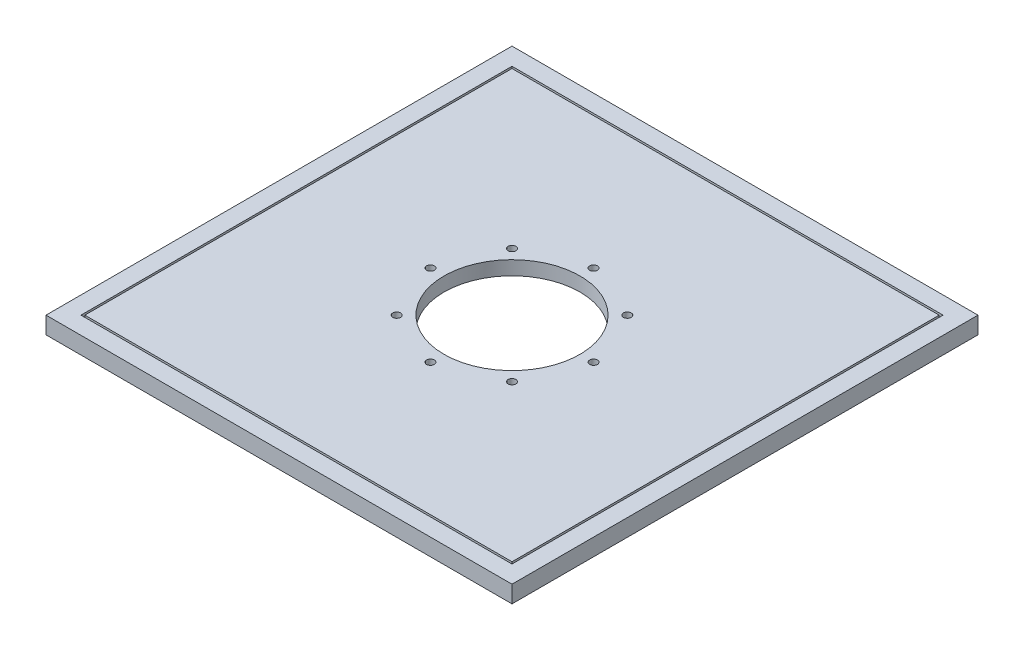
ISO-10303-21;
HEADER;
FILE_DESCRIPTION(('STEP AP214'),'2;1');
FILE_NAME('part.step','',(''),(''),'','','');
FILE_SCHEMA(('AUTOMOTIVE_DESIGN { 1 0 10303 214 1 1 1 1 }'));
ENDSEC;
DATA;
#1=APPLICATION_CONTEXT('core data for automotive mechanical design processes');
#2=APPLICATION_PROTOCOL_DEFINITION('international standard','automotive_design',2000,#1);
#3=PRODUCT_CONTEXT('',#1,'mechanical');
#4=PRODUCT('Part','Part','',(#3));
#5=PRODUCT_RELATED_PRODUCT_CATEGORY('part','',(#4));
#6=PRODUCT_DEFINITION_FORMATION('','',#4);
#7=PRODUCT_DEFINITION_CONTEXT('part definition',#1,'design');
#8=PRODUCT_DEFINITION('design','',#6,#7);
#9=PRODUCT_DEFINITION_SHAPE('','',#8);
#10=(LENGTH_UNIT() NAMED_UNIT(*) SI_UNIT(.MILLI.,.METRE.));
#11=(NAMED_UNIT(*) PLANE_ANGLE_UNIT() SI_UNIT($,.RADIAN.));
#12=(NAMED_UNIT(*) SI_UNIT($,.STERADIAN.) SOLID_ANGLE_UNIT());
#13=UNCERTAINTY_MEASURE_WITH_UNIT(LENGTH_MEASURE(1.E-05),#10,'distance_accuracy_value','');
#14=(GEOMETRIC_REPRESENTATION_CONTEXT(3) GLOBAL_UNCERTAINTY_ASSIGNED_CONTEXT((#13)) GLOBAL_UNIT_ASSIGNED_CONTEXT((#10,
#11,#12)) REPRESENTATION_CONTEXT('',''));
#15=CARTESIAN_POINT('',(0.,0.,0.));
#16=DIRECTION('',(0.,0.,1.));
#17=DIRECTION('',(1.,0.,0.));
#18=AXIS2_PLACEMENT_3D('',#15,#16,#17);
#19=CARTESIAN_POINT('',(0.,0.,0.));
#20=DIRECTION('',(0.,1.,0.));
#21=DIRECTION('',(0.,0.,1.));
#22=AXIS2_PLACEMENT_3D('',#19,#20,#21);
#23=CYLINDRICAL_SURFACE('',#22,87.5);
#24=CARTESIAN_POINT('',(0.,22.,0.));
#25=DIRECTION('',(0.,1.,0.));
#26=DIRECTION('',(0.,0.,1.));
#27=AXIS2_PLACEMENT_3D('',#24,#25,#26);
#28=CIRCLE('',#27,87.5);
#29=CARTESIAN_POINT('',(0.,22.,87.5));
#30=VERTEX_POINT('',#29);
#31=EDGE_CURVE('E202',#30,#30,#28,.T.);
#32=ORIENTED_EDGE('',*,*,#31,.T.);
#33=EDGE_LOOP('',(#32));
#34=FACE_BOUND('',#33,.T.);
#35=CARTESIAN_POINT('',(0.,4.,0.));
#36=DIRECTION('',(0.,-1.,0.));
#37=DIRECTION('',(0.,0.,-1.));
#38=AXIS2_PLACEMENT_3D('',#35,#36,#37);
#39=CIRCLE('',#38,87.5);
#40=CARTESIAN_POINT('',(0.,4.,-87.5));
#41=VERTEX_POINT('',#40);
#42=EDGE_CURVE('E47',#41,#41,#39,.F.);
#43=ORIENTED_EDGE('',*,*,#42,.F.);
#44=EDGE_LOOP('',(#43));
#45=FACE_BOUND('',#44,.T.);
#46=ADVANCED_FACE('F43',(#34,#45),#23,.F.);
#47=CARTESIAN_POINT('',(0.,22.,0.));
#48=DIRECTION('',(0.,1.,0.));
#49=DIRECTION('',(0.,0.,1.));
#50=AXIS2_PLACEMENT_3D('',#47,#48,#49);
#51=PLANE('',#50);
#52=CARTESIAN_POINT('',(0.,22.,105.));
#53=DIRECTION('',(0.,-1.,0.));
#54=DIRECTION('',(0.,0.,-1.));
#55=AXIS2_PLACEMENT_3D('',#52,#53,#54);
#56=CIRCLE('',#55,5.);
#57=CARTESIAN_POINT('',(0.,22.,100.));
#58=VERTEX_POINT('',#57);
#59=EDGE_CURVE('E474',#58,#58,#56,.T.);
#60=ORIENTED_EDGE('',*,*,#59,.T.);
#61=EDGE_LOOP('',(#60));
#62=FACE_BOUND('',#61,.T.);
#63=CARTESIAN_POINT('',(74.2462120245876,22.,74.2462120245874));
#64=DIRECTION('',(0.,-1.,0.));
#65=DIRECTION('',(0.,0.,-1.));
#66=AXIS2_PLACEMENT_3D('',#63,#64,#65);
#67=CIRCLE('',#66,5.00000000000001);
#68=CARTESIAN_POINT('',(74.2462120245876,22.,69.2462120245874));
#69=VERTEX_POINT('',#68);
#70=EDGE_CURVE('E482',#69,#69,#67,.T.);
#71=ORIENTED_EDGE('',*,*,#70,.T.);
#72=EDGE_LOOP('',(#71));
#73=FACE_BOUND('',#72,.T.);
#74=CARTESIAN_POINT('',(105.,22.,-3.66605540578529E-13));
#75=DIRECTION('',(0.,-1.,0.));
#76=DIRECTION('',(0.,0.,-1.));
#77=AXIS2_PLACEMENT_3D('',#74,#75,#76);
#78=CIRCLE('',#77,5.);
#79=CARTESIAN_POINT('',(105.,22.,-5.00000000000037));
#80=VERTEX_POINT('',#79);
#81=EDGE_CURVE('E490',#80,#80,#78,.T.);
#82=ORIENTED_EDGE('',*,*,#81,.T.);
#83=EDGE_LOOP('',(#82));
#84=FACE_BOUND('',#83,.T.);
#85=CARTESIAN_POINT('',(74.2462120245871,22.,-74.2462120245879));
#86=DIRECTION('',(0.,-1.,0.));
#87=DIRECTION('',(0.,0.,-1.));
#88=AXIS2_PLACEMENT_3D('',#85,#86,#87);
#89=CIRCLE('',#88,5.00000000000001);
#90=CARTESIAN_POINT('',(74.2462120245871,22.,-79.2462120245879));
#91=VERTEX_POINT('',#90);
#92=EDGE_CURVE('E496',#91,#91,#89,.T.);
#93=ORIENTED_EDGE('',*,*,#92,.T.);
#94=EDGE_LOOP('',(#93));
#95=FACE_BOUND('',#94,.T.);
#96=CARTESIAN_POINT('',(-7.33211081157058E-13,22.,-105.));
#97=DIRECTION('',(0.,-1.,0.));
#98=DIRECTION('',(0.,0.,-1.));
#99=AXIS2_PLACEMENT_3D('',#96,#97,#98);
#100=CIRCLE('',#99,5.);
#101=CARTESIAN_POINT('',(-7.33211081157058E-13,22.,-110.));
#102=VERTEX_POINT('',#101);
#103=EDGE_CURVE('E502',#102,#102,#100,.T.);
#104=ORIENTED_EDGE('',*,*,#103,.T.);
#105=EDGE_LOOP('',(#104));
#106=FACE_BOUND('',#105,.T.);
#107=CARTESIAN_POINT('',(-74.2462120245881,22.,-74.2462120245868));
#108=DIRECTION('',(0.,-1.,0.));
#109=DIRECTION('',(0.,0.,-1.));
#110=AXIS2_PLACEMENT_3D('',#107,#108,#109);
#111=CIRCLE('',#110,5.00000000000001);
#112=CARTESIAN_POINT('',(-74.2462120245881,22.,-79.2462120245868));
#113=VERTEX_POINT('',#112);
#114=EDGE_CURVE('E508',#113,#113,#111,.T.);
#115=ORIENTED_EDGE('',*,*,#114,.T.);
#116=EDGE_LOOP('',(#115));
#117=FACE_BOUND('',#116,.T.);
#118=CARTESIAN_POINT('',(-105.,22.,1.09981662173559E-12));
#119=DIRECTION('',(0.,-1.,0.));
#120=DIRECTION('',(0.,0.,-1.));
#121=AXIS2_PLACEMENT_3D('',#118,#119,#120);
#122=CIRCLE('',#121,5.);
#123=CARTESIAN_POINT('',(-105.,22.,-4.9999999999989));
#124=VERTEX_POINT('',#123);
#125=EDGE_CURVE('E514',#124,#124,#122,.T.);
#126=ORIENTED_EDGE('',*,*,#125,.T.);
#127=EDGE_LOOP('',(#126));
#128=FACE_BOUND('',#127,.T.);
#129=CARTESIAN_POINT('',(-74.2462120245866,22.,74.2462120245884));
#130=DIRECTION('',(0.,-1.,0.));
#131=DIRECTION('',(0.,0.,-1.));
#132=AXIS2_PLACEMENT_3D('',#129,#130,#131);
#133=CIRCLE('',#132,5.);
#134=CARTESIAN_POINT('',(-74.2462120245866,22.,69.2462120245884));
#135=VERTEX_POINT('',#134);
#136=EDGE_CURVE('E520',#135,#135,#133,.T.);
#137=ORIENTED_EDGE('',*,*,#136,.T.);
#138=EDGE_LOOP('',(#137));
#139=FACE_BOUND('',#138,.T.);
#140=ORIENTED_EDGE('',*,*,#31,.F.);
#141=EDGE_LOOP('',(#140));
#142=FACE_BOUND('',#141,.T.);
#143=DIRECTION('',(1.,0.,0.));
#144=VECTOR('',#143,1.);
#145=CARTESIAN_POINT('',(-275.,22.,275.));
#146=LINE('',#145,#144);
#147=CARTESIAN_POINT('',(-275.,22.,275.));
#148=VERTEX_POINT('',#147);
#149=CARTESIAN_POINT('',(275.,22.,275.));
#150=VERTEX_POINT('',#149);
#151=EDGE_CURVE('E159',#148,#150,#146,.T.);
#152=ORIENTED_EDGE('',*,*,#151,.T.);
#153=DIRECTION('',(0.,0.,-1.));
#154=VECTOR('',#153,1.);
#155=CARTESIAN_POINT('',(275.,22.,-275.));
#156=LINE('',#155,#154);
#157=CARTESIAN_POINT('',(275.,22.,-275.));
#158=VERTEX_POINT('',#157);
#159=EDGE_CURVE('E169',#150,#158,#156,.T.);
#160=ORIENTED_EDGE('',*,*,#159,.T.);
#161=DIRECTION('',(-1.,0.,0.));
#162=VECTOR('',#161,1.);
#163=CARTESIAN_POINT('',(-275.,22.,-275.));
#164=LINE('',#163,#162);
#165=CARTESIAN_POINT('',(-275.,22.,-275.));
#166=VERTEX_POINT('',#165);
#167=EDGE_CURVE('E139',#158,#166,#164,.T.);
#168=ORIENTED_EDGE('',*,*,#167,.T.);
#169=DIRECTION('',(0.,0.,1.));
#170=VECTOR('',#169,1.);
#171=CARTESIAN_POINT('',(-275.,22.,-275.));
#172=LINE('',#171,#170);
#173=EDGE_CURVE('E67',#166,#148,#172,.T.);
#174=ORIENTED_EDGE('',*,*,#173,.T.);
#175=EDGE_LOOP('',(#152,#160,#168,#174));
#176=FACE_BOUND('',#175,.T.);
#177=ADVANCED_FACE('F262',(#62,#73,#84,#95,#106,#117,#128,#139,#142,#176),#51,.T.);
#178=CARTESIAN_POINT('',(300.,22.,-300.));
#179=DIRECTION('',(-1.,0.,0.));
#180=DIRECTION('',(0.,0.,1.));
#181=AXIS2_PLACEMENT_3D('',#178,#179,#180);
#182=PLANE('',#181);
#183=DIRECTION('',(0.,0.,-1.));
#184=VECTOR('',#183,1.);
#185=CARTESIAN_POINT('',(300.,0.,-300.));
#186=LINE('',#185,#184);
#187=CARTESIAN_POINT('',(300.,0.,300.));
#188=VERTEX_POINT('',#187);
#189=CARTESIAN_POINT('',(300.,0.,-300.));
#190=VERTEX_POINT('',#189);
#191=EDGE_CURVE('E210',#188,#190,#186,.T.);
#192=ORIENTED_EDGE('',*,*,#191,.T.);
#193=DIRECTION('',(0.,-1.,0.));
#194=VECTOR('',#193,1.);
#195=CARTESIAN_POINT('',(300.,22.,-300.));
#196=LINE('',#195,#194);
#197=CARTESIAN_POINT('',(300.,22.,-300.));
#198=VERTEX_POINT('',#197);
#199=EDGE_CURVE('E11',#198,#190,#196,.T.);
#200=ORIENTED_EDGE('',*,*,#199,.F.);
#201=DIRECTION('',(0.,0.,-1.));
#202=VECTOR('',#201,1.);
#203=CARTESIAN_POINT('',(300.,22.,-300.));
#204=LINE('',#203,#202);
#205=CARTESIAN_POINT('',(300.,22.,300.));
#206=VERTEX_POINT('',#205);
#207=EDGE_CURVE('E211',#206,#198,#204,.T.);
#208=ORIENTED_EDGE('',*,*,#207,.F.);
#209=DIRECTION('',(0.,-1.,0.));
#210=VECTOR('',#209,1.);
#211=CARTESIAN_POINT('',(300.,22.,300.));
#212=LINE('',#211,#210);
#213=EDGE_CURVE('E221',#206,#188,#212,.T.);
#214=ORIENTED_EDGE('',*,*,#213,.T.);
#215=EDGE_LOOP('',(#192,#200,#208,#214));
#216=FACE_BOUND('',#215,.T.);
#217=ADVANCED_FACE('F45',(#216),#182,.F.);
#218=CARTESIAN_POINT('',(-300.,22.,-300.));
#219=DIRECTION('',(0.,0.,1.));
#220=DIRECTION('',(1.,0.,0.));
#221=AXIS2_PLACEMENT_3D('',#218,#219,#220);
#222=PLANE('',#221);
#223=DIRECTION('',(-1.,0.,0.));
#224=VECTOR('',#223,1.);
#225=CARTESIAN_POINT('',(-300.,0.,-300.));
#226=LINE('',#225,#224);
#227=CARTESIAN_POINT('',(-300.,0.,-300.));
#228=VERTEX_POINT('',#227);
#229=EDGE_CURVE('E224',#190,#228,#226,.T.);
#230=ORIENTED_EDGE('',*,*,#229,.T.);
#231=DIRECTION('',(0.,-1.,0.));
#232=VECTOR('',#231,1.);
#233=CARTESIAN_POINT('',(-300.,22.,-300.));
#234=LINE('',#233,#232);
#235=CARTESIAN_POINT('',(-300.,22.,-300.));
#236=VERTEX_POINT('',#235);
#237=EDGE_CURVE('E52',#236,#228,#234,.T.);
#238=ORIENTED_EDGE('',*,*,#237,.F.);
#239=DIRECTION('',(-1.,0.,0.));
#240=VECTOR('',#239,1.);
#241=CARTESIAN_POINT('',(-300.,22.,-300.));
#242=LINE('',#241,#240);
#243=EDGE_CURVE('E214',#198,#236,#242,.T.);
#244=ORIENTED_EDGE('',*,*,#243,.F.);
#245=ORIENTED_EDGE('',*,*,#199,.T.);
#246=EDGE_LOOP('',(#230,#238,#244,#245));
#247=FACE_BOUND('',#246,.T.);
#248=ADVANCED_FACE('F255',(#247),#222,.F.);
#249=CARTESIAN_POINT('',(-300.,22.,-300.));
#250=DIRECTION('',(1.,0.,0.));
#251=DIRECTION('',(0.,0.,-1.));
#252=AXIS2_PLACEMENT_3D('',#249,#250,#251);
#253=PLANE('',#252);
#254=DIRECTION('',(0.,0.,1.));
#255=VECTOR('',#254,1.);
#256=CARTESIAN_POINT('',(-300.,0.,-300.));
#257=LINE('',#256,#255);
#258=CARTESIAN_POINT('',(-300.,0.,300.));
#259=VERTEX_POINT('',#258);
#260=EDGE_CURVE('E226',#228,#259,#257,.T.);
#261=ORIENTED_EDGE('',*,*,#260,.T.);
#262=DIRECTION('',(0.,-1.,0.));
#263=VECTOR('',#262,1.);
#264=CARTESIAN_POINT('',(-300.,22.,300.));
#265=LINE('',#264,#263);
#266=CARTESIAN_POINT('',(-300.,22.,300.));
#267=VERTEX_POINT('',#266);
#268=EDGE_CURVE('E231',#267,#259,#265,.T.);
#269=ORIENTED_EDGE('',*,*,#268,.F.);
#270=DIRECTION('',(0.,0.,1.));
#271=VECTOR('',#270,1.);
#272=CARTESIAN_POINT('',(-300.,22.,-300.));
#273=LINE('',#272,#271);
#274=EDGE_CURVE('E217',#236,#267,#273,.T.);
#275=ORIENTED_EDGE('',*,*,#274,.F.);
#276=ORIENTED_EDGE('',*,*,#237,.T.);
#277=EDGE_LOOP('',(#261,#269,#275,#276));
#278=FACE_BOUND('',#277,.T.);
#279=ADVANCED_FACE('F239',(#278),#253,.F.);
#280=CARTESIAN_POINT('',(-300.,22.,300.));
#281=DIRECTION('',(0.,0.,-1.));
#282=DIRECTION('',(-1.,0.,0.));
#283=AXIS2_PLACEMENT_3D('',#280,#281,#282);
#284=PLANE('',#283);
#285=DIRECTION('',(1.,0.,0.));
#286=VECTOR('',#285,1.);
#287=CARTESIAN_POINT('',(-300.,0.,300.));
#288=LINE('',#287,#286);
#289=EDGE_CURVE('E215',#259,#188,#288,.T.);
#290=ORIENTED_EDGE('',*,*,#289,.T.);
#291=ORIENTED_EDGE('',*,*,#213,.F.);
#292=DIRECTION('',(1.,0.,0.));
#293=VECTOR('',#292,1.);
#294=CARTESIAN_POINT('',(-300.,22.,300.));
#295=LINE('',#294,#293);
#296=EDGE_CURVE('E219',#267,#206,#295,.T.);
#297=ORIENTED_EDGE('',*,*,#296,.F.);
#298=ORIENTED_EDGE('',*,*,#268,.T.);
#299=EDGE_LOOP('',(#290,#291,#297,#298));
#300=FACE_BOUND('',#299,.T.);
#301=ADVANCED_FACE('F248',(#300),#284,.F.);
#302=DIRECTION('',(0.,0.,-1.));
#303=VECTOR('',#302,1.);
#304=CARTESIAN_POINT('',(277.5,22.,-277.5));
#305=LINE('',#304,#303);
#306=CARTESIAN_POINT('',(277.5,22.,277.5));
#307=VERTEX_POINT('',#306);
#308=CARTESIAN_POINT('',(277.5,22.,-277.5));
#309=VERTEX_POINT('',#308);
#310=EDGE_CURVE('E59',#307,#309,#305,.T.);
#311=ORIENTED_EDGE('',*,*,#310,.F.);
#312=DIRECTION('',(1.,0.,0.));
#313=VECTOR('',#312,1.);
#314=CARTESIAN_POINT('',(-277.5,22.,277.5));
#315=LINE('',#314,#313);
#316=CARTESIAN_POINT('',(-277.5,22.,277.5));
#317=VERTEX_POINT('',#316);
#318=EDGE_CURVE('E181',#317,#307,#315,.T.);
#319=ORIENTED_EDGE('',*,*,#318,.F.);
#320=DIRECTION('',(0.,0.,1.));
#321=VECTOR('',#320,1.);
#322=CARTESIAN_POINT('',(-277.5,22.,-277.5));
#323=LINE('',#322,#321);
#324=CARTESIAN_POINT('',(-277.5,22.,-277.5));
#325=VERTEX_POINT('',#324);
#326=EDGE_CURVE('E195',#325,#317,#323,.T.);
#327=ORIENTED_EDGE('',*,*,#326,.F.);
#328=DIRECTION('',(-1.,0.,0.));
#329=VECTOR('',#328,1.);
#330=CARTESIAN_POINT('',(-277.5,22.,-277.5));
#331=LINE('',#330,#329);
#332=EDGE_CURVE('E192',#309,#325,#331,.T.);
#333=ORIENTED_EDGE('',*,*,#332,.F.);
#334=EDGE_LOOP('',(#311,#319,#327,#333));
#335=FACE_BOUND('',#334,.T.);
#336=ORIENTED_EDGE('',*,*,#207,.T.);
#337=ORIENTED_EDGE('',*,*,#243,.T.);
#338=ORIENTED_EDGE('',*,*,#274,.T.);
#339=ORIENTED_EDGE('',*,*,#296,.T.);
#340=EDGE_LOOP('',(#336,#337,#338,#339));
#341=FACE_BOUND('',#340,.T.);
#342=ADVANCED_FACE('F254',(#335,#341),#51,.T.);
#343=CARTESIAN_POINT('',(0.,0.,0.));
#344=DIRECTION('',(0.,1.,0.));
#345=DIRECTION('',(0.,0.,1.));
#346=AXIS2_PLACEMENT_3D('',#343,#344,#345);
#347=PLANE('',#346);
#348=CARTESIAN_POINT('',(0.,0.,0.));
#349=DIRECTION('',(0.,-1.,0.));
#350=DIRECTION('',(0.,0.,-1.));
#351=AXIS2_PLACEMENT_3D('',#348,#349,#350);
#352=CIRCLE('',#351,125.);
#353=CARTESIAN_POINT('',(0.,0.,-125.));
#354=VERTEX_POINT('',#353);
#355=EDGE_CURVE('E164',#354,#354,#352,.T.);
#356=ORIENTED_EDGE('',*,*,#355,.F.);
#357=EDGE_LOOP('',(#356));
#358=FACE_BOUND('',#357,.T.);
#359=ORIENTED_EDGE('',*,*,#191,.F.);
#360=ORIENTED_EDGE('',*,*,#289,.F.);
#361=ORIENTED_EDGE('',*,*,#260,.F.);
#362=ORIENTED_EDGE('',*,*,#229,.F.);
#363=EDGE_LOOP('',(#359,#360,#361,#362));
#364=FACE_BOUND('',#363,.T.);
#365=ADVANCED_FACE('F245',(#358,#364),#347,.F.);
#366=CARTESIAN_POINT('',(277.5,12.,-277.5));
#367=DIRECTION('',(1.,0.,0.));
#368=DIRECTION('',(0.,0.,-1.));
#369=AXIS2_PLACEMENT_3D('',#366,#367,#368);
#370=PLANE('',#369);
#371=ORIENTED_EDGE('',*,*,#310,.T.);
#372=DIRECTION('',(0.,1.,0.));
#373=VECTOR('',#372,1.);
#374=CARTESIAN_POINT('',(277.5,12.,-277.5));
#375=LINE('',#374,#373);
#376=CARTESIAN_POINT('',(277.5,12.,-277.5));
#377=VERTEX_POINT('',#376);
#378=EDGE_CURVE('E190',#377,#309,#375,.T.);
#379=ORIENTED_EDGE('',*,*,#378,.F.);
#380=DIRECTION('',(0.,0.,-1.));
#381=VECTOR('',#380,1.);
#382=CARTESIAN_POINT('',(277.5,12.,-277.5));
#383=LINE('',#382,#381);
#384=CARTESIAN_POINT('',(277.5,12.,277.5));
#385=VERTEX_POINT('',#384);
#386=EDGE_CURVE('E177',#385,#377,#383,.T.);
#387=ORIENTED_EDGE('',*,*,#386,.F.);
#388=DIRECTION('',(0.,1.,0.));
#389=VECTOR('',#388,1.);
#390=CARTESIAN_POINT('',(277.5,12.,277.5));
#391=LINE('',#390,#389);
#392=EDGE_CURVE('E200',#385,#307,#391,.T.);
#393=ORIENTED_EDGE('',*,*,#392,.T.);
#394=EDGE_LOOP('',(#371,#379,#387,#393));
#395=FACE_BOUND('',#394,.T.);
#396=ADVANCED_FACE('F275',(#395),#370,.F.);
#397=CARTESIAN_POINT('',(-277.5,12.,277.5));
#398=DIRECTION('',(0.,0.,1.));
#399=DIRECTION('',(1.,0.,0.));
#400=AXIS2_PLACEMENT_3D('',#397,#398,#399);
#401=PLANE('',#400);
#402=ORIENTED_EDGE('',*,*,#318,.T.);
#403=ORIENTED_EDGE('',*,*,#392,.F.);
#404=DIRECTION('',(1.,0.,0.));
#405=VECTOR('',#404,1.);
#406=CARTESIAN_POINT('',(-277.5,12.,277.5));
#407=LINE('',#406,#405);
#408=CARTESIAN_POINT('',(-277.5,12.,277.5));
#409=VERTEX_POINT('',#408);
#410=EDGE_CURVE('E187',#409,#385,#407,.T.);
#411=ORIENTED_EDGE('',*,*,#410,.F.);
#412=DIRECTION('',(0.,1.,0.));
#413=VECTOR('',#412,1.);
#414=CARTESIAN_POINT('',(-277.5,12.,277.5));
#415=LINE('',#414,#413);
#416=EDGE_CURVE('E203',#409,#317,#415,.T.);
#417=ORIENTED_EDGE('',*,*,#416,.T.);
#418=EDGE_LOOP('',(#402,#403,#411,#417));
#419=FACE_BOUND('',#418,.T.);
#420=ADVANCED_FACE('F300',(#419),#401,.F.);
#421=CARTESIAN_POINT('',(-277.5,12.,-277.5));
#422=DIRECTION('',(-1.,0.,0.));
#423=DIRECTION('',(0.,0.,1.));
#424=AXIS2_PLACEMENT_3D('',#421,#422,#423);
#425=PLANE('',#424);
#426=ORIENTED_EDGE('',*,*,#326,.T.);
#427=ORIENTED_EDGE('',*,*,#416,.F.);
#428=DIRECTION('',(0.,0.,1.));
#429=VECTOR('',#428,1.);
#430=CARTESIAN_POINT('',(-277.5,12.,-277.5));
#431=LINE('',#430,#429);
#432=CARTESIAN_POINT('',(-277.5,12.,-277.5));
#433=VERTEX_POINT('',#432);
#434=EDGE_CURVE('E184',#433,#409,#431,.T.);
#435=ORIENTED_EDGE('',*,*,#434,.F.);
#436=DIRECTION('',(0.,1.,0.));
#437=VECTOR('',#436,1.);
#438=CARTESIAN_POINT('',(-277.5,12.,-277.5));
#439=LINE('',#438,#437);
#440=EDGE_CURVE('E205',#433,#325,#439,.T.);
#441=ORIENTED_EDGE('',*,*,#440,.T.);
#442=EDGE_LOOP('',(#426,#427,#435,#441));
#443=FACE_BOUND('',#442,.T.);
#444=ADVANCED_FACE('F308',(#443),#425,.F.);
#445=CARTESIAN_POINT('',(-277.5,12.,-277.5));
#446=DIRECTION('',(0.,0.,-1.));
#447=DIRECTION('',(-1.,0.,0.));
#448=AXIS2_PLACEMENT_3D('',#445,#446,#447);
#449=PLANE('',#448);
#450=ORIENTED_EDGE('',*,*,#332,.T.);
#451=ORIENTED_EDGE('',*,*,#440,.F.);
#452=DIRECTION('',(-1.,0.,0.));
#453=VECTOR('',#452,1.);
#454=CARTESIAN_POINT('',(-277.5,12.,-277.5));
#455=LINE('',#454,#453);
#456=EDGE_CURVE('E180',#377,#433,#455,.T.);
#457=ORIENTED_EDGE('',*,*,#456,.F.);
#458=ORIENTED_EDGE('',*,*,#378,.T.);
#459=EDGE_LOOP('',(#450,#451,#457,#458));
#460=FACE_BOUND('',#459,.T.);
#461=ADVANCED_FACE('F317',(#460),#449,.F.);
#462=CARTESIAN_POINT('',(0.,12.,0.));
#463=DIRECTION('',(0.,1.,0.));
#464=DIRECTION('',(0.,0.,1.));
#465=AXIS2_PLACEMENT_3D('',#462,#463,#464);
#466=PLANE('',#465);
#467=DIRECTION('',(1.,0.,0.));
#468=VECTOR('',#467,1.);
#469=CARTESIAN_POINT('',(-275.,12.,275.));
#470=LINE('',#469,#468);
#471=CARTESIAN_POINT('',(-275.,12.,275.));
#472=VERTEX_POINT('',#471);
#473=CARTESIAN_POINT('',(275.,12.,275.));
#474=VERTEX_POINT('',#473);
#475=EDGE_CURVE('E145',#472,#474,#470,.T.);
#476=ORIENTED_EDGE('',*,*,#475,.F.);
#477=DIRECTION('',(0.,0.,1.));
#478=VECTOR('',#477,1.);
#479=CARTESIAN_POINT('',(-275.,12.,-275.));
#480=LINE('',#479,#478);
#481=CARTESIAN_POINT('',(-275.,12.,-275.));
#482=VERTEX_POINT('',#481);
#483=EDGE_CURVE('E155',#482,#472,#480,.T.);
#484=ORIENTED_EDGE('',*,*,#483,.F.);
#485=DIRECTION('',(-1.,0.,0.));
#486=VECTOR('',#485,1.);
#487=CARTESIAN_POINT('',(-275.,12.,-275.));
#488=LINE('',#487,#486);
#489=CARTESIAN_POINT('',(275.,12.,-275.));
#490=VERTEX_POINT('',#489);
#491=EDGE_CURVE('E137',#490,#482,#488,.T.);
#492=ORIENTED_EDGE('',*,*,#491,.F.);
#493=DIRECTION('',(0.,0.,-1.));
#494=VECTOR('',#493,1.);
#495=CARTESIAN_POINT('',(275.,12.,-275.));
#496=LINE('',#495,#494);
#497=EDGE_CURVE('E152',#474,#490,#496,.T.);
#498=ORIENTED_EDGE('',*,*,#497,.F.);
#499=EDGE_LOOP('',(#476,#484,#492,#498));
#500=FACE_BOUND('',#499,.T.);
#501=ORIENTED_EDGE('',*,*,#386,.T.);
#502=ORIENTED_EDGE('',*,*,#456,.T.);
#503=ORIENTED_EDGE('',*,*,#434,.T.);
#504=ORIENTED_EDGE('',*,*,#410,.T.);
#505=EDGE_LOOP('',(#501,#502,#503,#504));
#506=FACE_BOUND('',#505,.T.);
#507=ADVANCED_FACE('F150',(#500,#506),#466,.T.);
#508=CARTESIAN_POINT('',(275.,12.,-275.));
#509=DIRECTION('',(1.,0.,0.));
#510=DIRECTION('',(0.,0.,-1.));
#511=AXIS2_PLACEMENT_3D('',#508,#509,#510);
#512=PLANE('',#511);
#513=ORIENTED_EDGE('',*,*,#159,.F.);
#514=DIRECTION('',(0.,1.,0.));
#515=VECTOR('',#514,1.);
#516=CARTESIAN_POINT('',(275.,12.,275.));
#517=LINE('',#516,#515);
#518=EDGE_CURVE('E158',#474,#150,#517,.T.);
#519=ORIENTED_EDGE('',*,*,#518,.F.);
#520=ORIENTED_EDGE('',*,*,#497,.T.);
#521=DIRECTION('',(0.,1.,0.));
#522=VECTOR('',#521,1.);
#523=CARTESIAN_POINT('',(275.,12.,-275.));
#524=LINE('',#523,#522);
#525=EDGE_CURVE('E134',#490,#158,#524,.T.);
#526=ORIENTED_EDGE('',*,*,#525,.T.);
#527=EDGE_LOOP('',(#513,#519,#520,#526));
#528=FACE_BOUND('',#527,.T.);
#529=ADVANCED_FACE('F157',(#528),#512,.T.);
#530=CARTESIAN_POINT('',(-275.,12.,275.));
#531=DIRECTION('',(0.,0.,1.));
#532=DIRECTION('',(1.,0.,0.));
#533=AXIS2_PLACEMENT_3D('',#530,#531,#532);
#534=PLANE('',#533);
#535=ORIENTED_EDGE('',*,*,#151,.F.);
#536=DIRECTION('',(0.,1.,0.));
#537=VECTOR('',#536,1.);
#538=CARTESIAN_POINT('',(-275.,12.,275.));
#539=LINE('',#538,#537);
#540=EDGE_CURVE('E174',#472,#148,#539,.T.);
#541=ORIENTED_EDGE('',*,*,#540,.F.);
#542=ORIENTED_EDGE('',*,*,#475,.T.);
#543=ORIENTED_EDGE('',*,*,#518,.T.);
#544=EDGE_LOOP('',(#535,#541,#542,#543));
#545=FACE_BOUND('',#544,.T.);
#546=ADVANCED_FACE('F340',(#545),#534,.T.);
#547=CARTESIAN_POINT('',(-275.,12.,-275.));
#548=DIRECTION('',(-1.,0.,0.));
#549=DIRECTION('',(0.,0.,1.));
#550=AXIS2_PLACEMENT_3D('',#547,#548,#549);
#551=PLANE('',#550);
#552=ORIENTED_EDGE('',*,*,#173,.F.);
#553=DIRECTION('',(0.,1.,0.));
#554=VECTOR('',#553,1.);
#555=CARTESIAN_POINT('',(-275.,12.,-275.));
#556=LINE('',#555,#554);
#557=EDGE_CURVE('E144',#482,#166,#556,.T.);
#558=ORIENTED_EDGE('',*,*,#557,.F.);
#559=ORIENTED_EDGE('',*,*,#483,.T.);
#560=ORIENTED_EDGE('',*,*,#540,.T.);
#561=EDGE_LOOP('',(#552,#558,#559,#560));
#562=FACE_BOUND('',#561,.T.);
#563=ADVANCED_FACE('F348',(#562),#551,.T.);
#564=CARTESIAN_POINT('',(-275.,12.,-275.));
#565=DIRECTION('',(0.,0.,-1.));
#566=DIRECTION('',(-1.,0.,0.));
#567=AXIS2_PLACEMENT_3D('',#564,#565,#566);
#568=PLANE('',#567);
#569=ORIENTED_EDGE('',*,*,#167,.F.);
#570=ORIENTED_EDGE('',*,*,#525,.F.);
#571=ORIENTED_EDGE('',*,*,#491,.T.);
#572=ORIENTED_EDGE('',*,*,#557,.T.);
#573=EDGE_LOOP('',(#569,#570,#571,#572));
#574=FACE_BOUND('',#573,.T.);
#575=ADVANCED_FACE('F136',(#574),#568,.T.);
#576=CARTESIAN_POINT('',(0.,4.,0.));
#577=DIRECTION('',(0.,-1.,0.));
#578=DIRECTION('',(0.,0.,-1.));
#579=AXIS2_PLACEMENT_3D('',#576,#577,#578);
#580=PLANE('',#579);
#581=CARTESIAN_POINT('',(0.,4.,105.));
#582=DIRECTION('',(0.,-1.,0.));
#583=DIRECTION('',(0.,0.,-1.));
#584=AXIS2_PLACEMENT_3D('',#581,#582,#583);
#585=CIRCLE('',#584,5.);
#586=CARTESIAN_POINT('',(0.,4.,100.));
#587=VERTEX_POINT('',#586);
#588=EDGE_CURVE('E477',#587,#587,#585,.T.);
#589=ORIENTED_EDGE('',*,*,#588,.F.);
#590=EDGE_LOOP('',(#589));
#591=FACE_BOUND('',#590,.T.);
#592=CARTESIAN_POINT('',(74.2462120245876,4.,74.2462120245874));
#593=DIRECTION('',(0.,-1.,0.));
#594=DIRECTION('',(0.,0.,-1.));
#595=AXIS2_PLACEMENT_3D('',#592,#593,#594);
#596=CIRCLE('',#595,5.00000000000001);
#597=CARTESIAN_POINT('',(74.2462120245876,4.,69.2462120245874));
#598=VERTEX_POINT('',#597);
#599=EDGE_CURVE('E478',#598,#598,#596,.T.);
#600=ORIENTED_EDGE('',*,*,#599,.F.);
#601=EDGE_LOOP('',(#600));
#602=FACE_BOUND('',#601,.T.);
#603=CARTESIAN_POINT('',(105.,4.,-3.66605540578529E-13));
#604=DIRECTION('',(0.,-1.,0.));
#605=DIRECTION('',(0.,0.,-1.));
#606=AXIS2_PLACEMENT_3D('',#603,#604,#605);
#607=CIRCLE('',#606,5.);
#608=CARTESIAN_POINT('',(105.,4.,-5.00000000000037));
#609=VERTEX_POINT('',#608);
#610=EDGE_CURVE('E487',#609,#609,#607,.T.);
#611=ORIENTED_EDGE('',*,*,#610,.F.);
#612=EDGE_LOOP('',(#611));
#613=FACE_BOUND('',#612,.T.);
#614=CARTESIAN_POINT('',(74.2462120245871,4.,-74.2462120245879));
#615=DIRECTION('',(0.,-1.,0.));
#616=DIRECTION('',(0.,0.,-1.));
#617=AXIS2_PLACEMENT_3D('',#614,#615,#616);
#618=CIRCLE('',#617,5.00000000000001);
#619=CARTESIAN_POINT('',(74.2462120245871,4.,-79.2462120245879));
#620=VERTEX_POINT('',#619);
#621=EDGE_CURVE('E493',#620,#620,#618,.T.);
#622=ORIENTED_EDGE('',*,*,#621,.F.);
#623=EDGE_LOOP('',(#622));
#624=FACE_BOUND('',#623,.T.);
#625=CARTESIAN_POINT('',(-7.33211081157058E-13,4.,-105.));
#626=DIRECTION('',(0.,-1.,0.));
#627=DIRECTION('',(0.,0.,-1.));
#628=AXIS2_PLACEMENT_3D('',#625,#626,#627);
#629=CIRCLE('',#628,5.);
#630=CARTESIAN_POINT('',(-7.33211081157058E-13,4.,-110.));
#631=VERTEX_POINT('',#630);
#632=EDGE_CURVE('E499',#631,#631,#629,.T.);
#633=ORIENTED_EDGE('',*,*,#632,.F.);
#634=EDGE_LOOP('',(#633));
#635=FACE_BOUND('',#634,.T.);
#636=CARTESIAN_POINT('',(-74.2462120245881,4.,-74.2462120245868));
#637=DIRECTION('',(0.,-1.,0.));
#638=DIRECTION('',(0.,0.,-1.));
#639=AXIS2_PLACEMENT_3D('',#636,#637,#638);
#640=CIRCLE('',#639,5.00000000000001);
#641=CARTESIAN_POINT('',(-74.2462120245881,4.,-79.2462120245868));
#642=VERTEX_POINT('',#641);
#643=EDGE_CURVE('E505',#642,#642,#640,.T.);
#644=ORIENTED_EDGE('',*,*,#643,.F.);
#645=EDGE_LOOP('',(#644));
#646=FACE_BOUND('',#645,.T.);
#647=CARTESIAN_POINT('',(-105.,4.,1.09981662173559E-12));
#648=DIRECTION('',(0.,-1.,0.));
#649=DIRECTION('',(0.,0.,-1.));
#650=AXIS2_PLACEMENT_3D('',#647,#648,#649);
#651=CIRCLE('',#650,5.);
#652=CARTESIAN_POINT('',(-105.,4.,-4.9999999999989));
#653=VERTEX_POINT('',#652);
#654=EDGE_CURVE('E511',#653,#653,#651,.T.);
#655=ORIENTED_EDGE('',*,*,#654,.F.);
#656=EDGE_LOOP('',(#655));
#657=FACE_BOUND('',#656,.T.);
#658=CARTESIAN_POINT('',(-74.2462120245866,4.,74.2462120245884));
#659=DIRECTION('',(0.,-1.,0.));
#660=DIRECTION('',(0.,0.,-1.));
#661=AXIS2_PLACEMENT_3D('',#658,#659,#660);
#662=CIRCLE('',#661,5.);
#663=CARTESIAN_POINT('',(-74.2462120245866,4.,69.2462120245884));
#664=VERTEX_POINT('',#663);
#665=EDGE_CURVE('E517',#664,#664,#662,.T.);
#666=ORIENTED_EDGE('',*,*,#665,.F.);
#667=EDGE_LOOP('',(#666));
#668=FACE_BOUND('',#667,.T.);
#669=CARTESIAN_POINT('',(0.,4.,0.));
#670=DIRECTION('',(0.,-1.,0.));
#671=DIRECTION('',(0.,0.,-1.));
#672=AXIS2_PLACEMENT_3D('',#669,#670,#671);
#673=CIRCLE('',#672,125.);
#674=CARTESIAN_POINT('',(0.,4.,-125.));
#675=VERTEX_POINT('',#674);
#676=EDGE_CURVE('E522',#675,#675,#673,.T.);
#677=ORIENTED_EDGE('',*,*,#676,.T.);
#678=EDGE_LOOP('',(#677));
#679=FACE_BOUND('',#678,.T.);
#680=ORIENTED_EDGE('',*,*,#42,.T.);
#681=EDGE_LOOP('',(#680));
#682=FACE_BOUND('',#681,.T.);
#683=ADVANCED_FACE('F362',(#591,#602,#613,#624,#635,#646,#657,#668,#679,#682),#580,.T.);
#684=CARTESIAN_POINT('',(0.,4.,0.));
#685=DIRECTION('',(0.,-1.,0.));
#686=DIRECTION('',(0.,0.,-1.));
#687=AXIS2_PLACEMENT_3D('',#684,#685,#686);
#688=CYLINDRICAL_SURFACE('',#687,125.);
#689=ORIENTED_EDGE('',*,*,#676,.F.);
#690=EDGE_LOOP('',(#689));
#691=FACE_BOUND('',#690,.T.);
#692=ORIENTED_EDGE('',*,*,#355,.T.);
#693=EDGE_LOOP('',(#692));
#694=FACE_BOUND('',#693,.T.);
#695=ADVANCED_FACE('F378',(#691,#694),#688,.F.);
#696=CARTESIAN_POINT('',(-74.2462120245866,22.,74.2462120245884));
#697=DIRECTION('',(0.,-1.,0.));
#698=DIRECTION('',(0.,0.,-1.));
#699=AXIS2_PLACEMENT_3D('',#696,#697,#698);
#700=CYLINDRICAL_SURFACE('',#699,5.);
#701=ORIENTED_EDGE('',*,*,#136,.F.);
#702=EDGE_LOOP('',(#701));
#703=FACE_BOUND('',#702,.T.);
#704=ORIENTED_EDGE('',*,*,#665,.T.);
#705=EDGE_LOOP('',(#704));
#706=FACE_BOUND('',#705,.T.);
#707=ADVANCED_FACE('F389',(#703,#706),#700,.F.);
#708=CARTESIAN_POINT('',(-105.,22.,1.09981662173559E-12));
#709=DIRECTION('',(0.,-1.,0.));
#710=DIRECTION('',(0.,0.,-1.));
#711=AXIS2_PLACEMENT_3D('',#708,#709,#710);
#712=CYLINDRICAL_SURFACE('',#711,5.);
#713=ORIENTED_EDGE('',*,*,#125,.F.);
#714=EDGE_LOOP('',(#713));
#715=FACE_BOUND('',#714,.T.);
#716=ORIENTED_EDGE('',*,*,#654,.T.);
#717=EDGE_LOOP('',(#716));
#718=FACE_BOUND('',#717,.T.);
#719=ADVANCED_FACE('F398',(#715,#718),#712,.F.);
#720=CARTESIAN_POINT('',(-74.2462120245881,22.,-74.2462120245868));
#721=DIRECTION('',(0.,-1.,0.));
#722=DIRECTION('',(0.,0.,-1.));
#723=AXIS2_PLACEMENT_3D('',#720,#721,#722);
#724=CYLINDRICAL_SURFACE('',#723,5.00000000000001);
#725=ORIENTED_EDGE('',*,*,#114,.F.);
#726=EDGE_LOOP('',(#725));
#727=FACE_BOUND('',#726,.T.);
#728=ORIENTED_EDGE('',*,*,#643,.T.);
#729=EDGE_LOOP('',(#728));
#730=FACE_BOUND('',#729,.T.);
#731=ADVANCED_FACE('F408',(#727,#730),#724,.F.);
#732=CARTESIAN_POINT('',(-7.33211081157058E-13,22.,-105.));
#733=DIRECTION('',(0.,-1.,0.));
#734=DIRECTION('',(0.,0.,-1.));
#735=AXIS2_PLACEMENT_3D('',#732,#733,#734);
#736=CYLINDRICAL_SURFACE('',#735,5.);
#737=ORIENTED_EDGE('',*,*,#103,.F.);
#738=EDGE_LOOP('',(#737));
#739=FACE_BOUND('',#738,.T.);
#740=ORIENTED_EDGE('',*,*,#632,.T.);
#741=EDGE_LOOP('',(#740));
#742=FACE_BOUND('',#741,.T.);
#743=ADVANCED_FACE('F418',(#739,#742),#736,.F.);
#744=CARTESIAN_POINT('',(74.2462120245871,22.,-74.2462120245879));
#745=DIRECTION('',(0.,-1.,0.));
#746=DIRECTION('',(0.,0.,-1.));
#747=AXIS2_PLACEMENT_3D('',#744,#745,#746);
#748=CYLINDRICAL_SURFACE('',#747,5.00000000000001);
#749=ORIENTED_EDGE('',*,*,#92,.F.);
#750=EDGE_LOOP('',(#749));
#751=FACE_BOUND('',#750,.T.);
#752=ORIENTED_EDGE('',*,*,#621,.T.);
#753=EDGE_LOOP('',(#752));
#754=FACE_BOUND('',#753,.T.);
#755=ADVANCED_FACE('F428',(#751,#754),#748,.F.);
#756=CARTESIAN_POINT('',(105.,22.,-3.66605540578529E-13));
#757=DIRECTION('',(0.,-1.,0.));
#758=DIRECTION('',(0.,0.,-1.));
#759=AXIS2_PLACEMENT_3D('',#756,#757,#758);
#760=CYLINDRICAL_SURFACE('',#759,5.);
#761=ORIENTED_EDGE('',*,*,#81,.F.);
#762=EDGE_LOOP('',(#761));
#763=FACE_BOUND('',#762,.T.);
#764=ORIENTED_EDGE('',*,*,#610,.T.);
#765=EDGE_LOOP('',(#764));
#766=FACE_BOUND('',#765,.T.);
#767=ADVANCED_FACE('F438',(#763,#766),#760,.F.);
#768=CARTESIAN_POINT('',(74.2462120245876,22.,74.2462120245874));
#769=DIRECTION('',(0.,-1.,0.));
#770=DIRECTION('',(0.,0.,-1.));
#771=AXIS2_PLACEMENT_3D('',#768,#769,#770);
#772=CYLINDRICAL_SURFACE('',#771,5.00000000000001);
#773=ORIENTED_EDGE('',*,*,#70,.F.);
#774=EDGE_LOOP('',(#773));
#775=FACE_BOUND('',#774,.T.);
#776=ORIENTED_EDGE('',*,*,#599,.T.);
#777=EDGE_LOOP('',(#776));
#778=FACE_BOUND('',#777,.T.);
#779=ADVANCED_FACE('F448',(#775,#778),#772,.F.);
#780=CARTESIAN_POINT('',(0.,22.,105.));
#781=DIRECTION('',(0.,-1.,0.));
#782=DIRECTION('',(0.,0.,-1.));
#783=AXIS2_PLACEMENT_3D('',#780,#781,#782);
#784=CYLINDRICAL_SURFACE('',#783,5.);
#785=ORIENTED_EDGE('',*,*,#59,.F.);
#786=EDGE_LOOP('',(#785));
#787=FACE_BOUND('',#786,.T.);
#788=ORIENTED_EDGE('',*,*,#588,.T.);
#789=EDGE_LOOP('',(#788));
#790=FACE_BOUND('',#789,.T.);
#791=ADVANCED_FACE('F458',(#787,#790),#784,.F.);
#792=CLOSED_SHELL('',(#46,#177,#217,#248,#279,#301,#342,#365,#396,#420,#444,#461,#507,#529,#546,
#563,#575,#683,#695,#707,#719,#731,#743,#755,#767,#779,#791));
#793=MANIFOLD_SOLID_BREP('B2',#792);
#794=ADVANCED_BREP_SHAPE_REPRESENTATION('',(#18,#793),#14);
#795=SHAPE_DEFINITION_REPRESENTATION(#9,#794);
ENDSEC;
END-ISO-10303-21;
